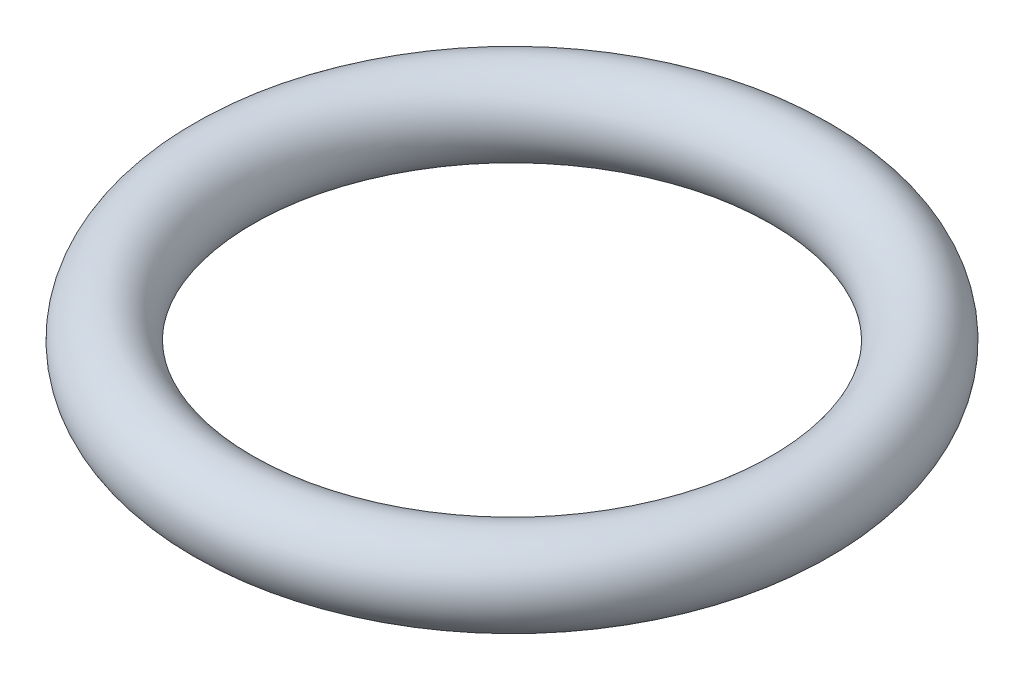
ISO-10303-21;
HEADER;
FILE_DESCRIPTION(('STEP AP214'),'2;1');
FILE_NAME('part.step','',(''),(''),'','','');
FILE_SCHEMA(('AUTOMOTIVE_DESIGN { 1 0 10303 214 1 1 1 1 }'));
ENDSEC;
DATA;
#1=APPLICATION_CONTEXT('core data for automotive mechanical design processes');
#2=APPLICATION_PROTOCOL_DEFINITION('international standard','automotive_design',2000,#1);
#3=PRODUCT_CONTEXT('',#1,'mechanical');
#4=PRODUCT('Part','Part','',(#3));
#5=PRODUCT_RELATED_PRODUCT_CATEGORY('part','',(#4));
#6=PRODUCT_DEFINITION_FORMATION('','',#4);
#7=PRODUCT_DEFINITION_CONTEXT('part definition',#1,'design');
#8=PRODUCT_DEFINITION('design','',#6,#7);
#9=PRODUCT_DEFINITION_SHAPE('','',#8);
#10=(LENGTH_UNIT() NAMED_UNIT(*) SI_UNIT(.MILLI.,.METRE.));
#11=(NAMED_UNIT(*) PLANE_ANGLE_UNIT() SI_UNIT($,.RADIAN.));
#12=(NAMED_UNIT(*) SI_UNIT($,.STERADIAN.) SOLID_ANGLE_UNIT());
#13=UNCERTAINTY_MEASURE_WITH_UNIT(LENGTH_MEASURE(1.E-05),#10,'distance_accuracy_value','');
#14=(GEOMETRIC_REPRESENTATION_CONTEXT(3) GLOBAL_UNCERTAINTY_ASSIGNED_CONTEXT((#13)) GLOBAL_UNIT_ASSIGNED_CONTEXT((#10,
#11,#12)) REPRESENTATION_CONTEXT('',''));
#15=CARTESIAN_POINT('',(0.,0.,0.));
#16=DIRECTION('',(0.,0.,1.));
#17=DIRECTION('',(1.,0.,0.));
#18=AXIS2_PLACEMENT_3D('',#15,#16,#17);
#19=CARTESIAN_POINT('',(0.,0.,0.));
#20=DIRECTION('',(0.,-1.,0.));
#21=DIRECTION('',(0.,0.,-1.));
#22=AXIS2_PLACEMENT_3D('',#19,#20,#21);
#23=TOROIDAL_SURFACE('',#22,5.25,0.750000000000001);
#24=CARTESIAN_POINT('',(0.,0.,-6.));
#25=VERTEX_POINT('',#24);
#26=VERTEX_LOOP('',#25);
#27=FACE_BOUND('',#26,.T.);
#28=ADVANCED_FACE('F36',(#27),#23,.T.);
#29=CLOSED_SHELL('',(#28));
#30=MANIFOLD_SOLID_BREP('B2',#29);
#31=ADVANCED_BREP_SHAPE_REPRESENTATION('',(#18,#30),#14);
#32=SHAPE_DEFINITION_REPRESENTATION(#9,#31);
ENDSEC;
END-ISO-10303-21;
